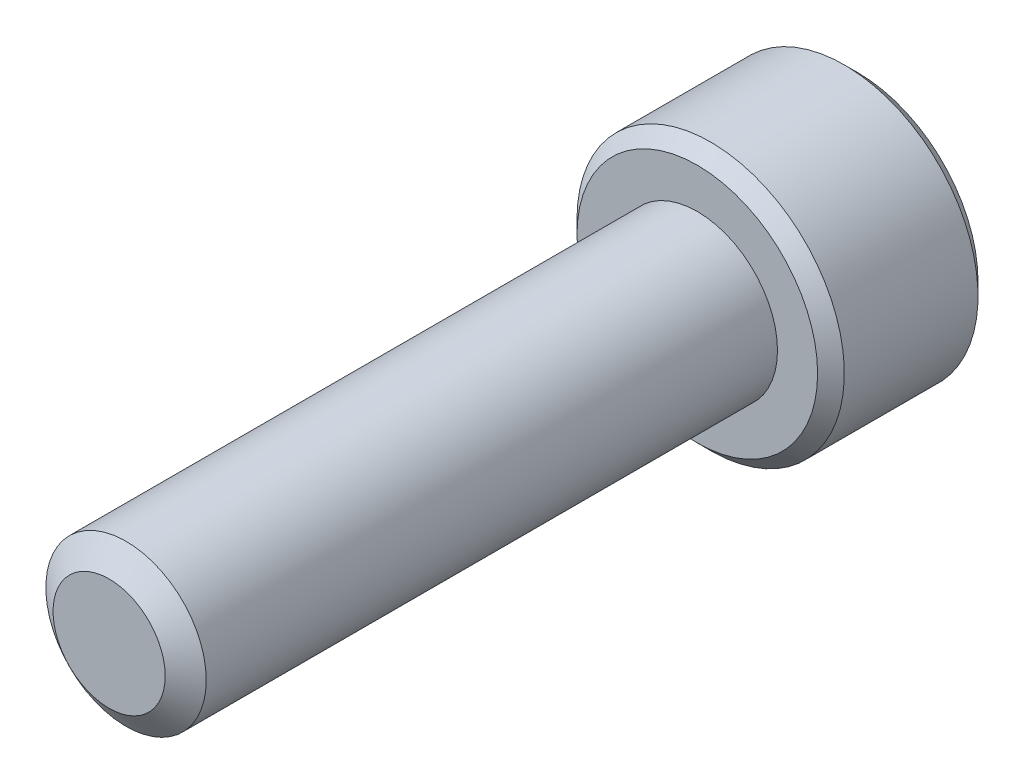
ISO-10303-21;
HEADER;
FILE_DESCRIPTION(('STEP AP214'),'2;1');
FILE_NAME('part.step','',(''),(''),'','','');
FILE_SCHEMA(('AUTOMOTIVE_DESIGN { 1 0 10303 214 1 1 1 1 }'));
ENDSEC;
DATA;
#1=APPLICATION_CONTEXT('core data for automotive mechanical design processes');
#2=APPLICATION_PROTOCOL_DEFINITION('international standard','automotive_design',2000,#1);
#3=PRODUCT_CONTEXT('',#1,'mechanical');
#4=PRODUCT('Part','Part','',(#3));
#5=PRODUCT_RELATED_PRODUCT_CATEGORY('part','',(#4));
#6=PRODUCT_DEFINITION_FORMATION('','',#4);
#7=PRODUCT_DEFINITION_CONTEXT('part definition',#1,'design');
#8=PRODUCT_DEFINITION('design','',#6,#7);
#9=PRODUCT_DEFINITION_SHAPE('','',#8);
#10=(LENGTH_UNIT() NAMED_UNIT(*) SI_UNIT(.MILLI.,.METRE.));
#11=(NAMED_UNIT(*) PLANE_ANGLE_UNIT() SI_UNIT($,.RADIAN.));
#12=(NAMED_UNIT(*) SI_UNIT($,.STERADIAN.) SOLID_ANGLE_UNIT());
#13=UNCERTAINTY_MEASURE_WITH_UNIT(LENGTH_MEASURE(1.E-05),#10,'distance_accuracy_value','');
#14=(GEOMETRIC_REPRESENTATION_CONTEXT(3) GLOBAL_UNCERTAINTY_ASSIGNED_CONTEXT((#13)) GLOBAL_UNIT_ASSIGNED_CONTEXT((#10,
#11,#12)) REPRESENTATION_CONTEXT('',''));
#15=CARTESIAN_POINT('',(0.,0.,0.));
#16=DIRECTION('',(0.,0.,1.));
#17=DIRECTION('',(1.,0.,0.));
#18=AXIS2_PLACEMENT_3D('',#15,#16,#17);
#19=CARTESIAN_POINT('',(0.,0.,-22.));
#20=DIRECTION('',(0.,0.,1.));
#21=DIRECTION('',(1.,0.,0.));
#22=AXIS2_PLACEMENT_3D('',#19,#20,#21);
#23=CYLINDRICAL_SURFACE('',#22,3.);
#24=CARTESIAN_POINT('',(0.,0.,-22.));
#25=DIRECTION('',(0.,0.,-1.));
#26=DIRECTION('',(-1.,0.,0.));
#27=AXIS2_PLACEMENT_3D('',#24,#25,#26);
#28=CIRCLE('',#27,3.);
#29=CARTESIAN_POINT('',(-3.,0.,-22.));
#30=VERTEX_POINT('',#29);
#31=EDGE_CURVE('E154',#30,#30,#28,.F.);
#32=ORIENTED_EDGE('',*,*,#31,.T.);
#33=EDGE_LOOP('',(#32));
#34=FACE_BOUND('',#33,.T.);
#35=CARTESIAN_POINT('',(0.,0.,-0.632650851713494));
#36=DIRECTION('',(0.,0.,1.));
#37=DIRECTION('',(1.,0.,0.));
#38=AXIS2_PLACEMENT_3D('',#35,#36,#37);
#39=CIRCLE('',#38,3.);
#40=CARTESIAN_POINT('',(3.,0.,-0.632650851713494));
#41=VERTEX_POINT('',#40);
#42=EDGE_CURVE('E171',#41,#41,#39,.T.);
#43=ORIENTED_EDGE('',*,*,#42,.F.);
#44=EDGE_LOOP('',(#43));
#45=FACE_BOUND('',#44,.T.);
#46=ADVANCED_FACE('F39',(#34,#45),#23,.T.);
#47=CARTESIAN_POINT('',(0.,0.,0.));
#48=DIRECTION('',(0.,0.,-1.));
#49=DIRECTION('',(-1.,0.,0.));
#50=AXIS2_PLACEMENT_3D('',#47,#48,#49);
#51=CONICAL_SURFACE('',#50,2.09648094716167,0.959931088596884);
#52=ORIENTED_EDGE('',*,*,#42,.T.);
#53=EDGE_LOOP('',(#52));
#54=FACE_BOUND('',#53,.T.);
#55=CARTESIAN_POINT('',(0.,0.,0.));
#56=DIRECTION('',(0.,0.,1.));
#57=DIRECTION('',(1.,0.,0.));
#58=AXIS2_PLACEMENT_3D('',#55,#56,#57);
#59=CIRCLE('',#58,2.09648094716167);
#60=CARTESIAN_POINT('',(2.09648094716167,0.,0.));
#61=VERTEX_POINT('',#60);
#62=EDGE_CURVE('E167',#61,#61,#59,.T.);
#63=ORIENTED_EDGE('',*,*,#62,.F.);
#64=EDGE_LOOP('',(#63));
#65=FACE_BOUND('',#64,.T.);
#66=ADVANCED_FACE('F220',(#54,#65),#51,.T.);
#67=CARTESIAN_POINT('',(0.,0.,0.));
#68=DIRECTION('',(0.,0.,1.));
#69=DIRECTION('',(1.,0.,0.));
#70=AXIS2_PLACEMENT_3D('',#67,#68,#69);
#71=PLANE('',#70);
#72=ORIENTED_EDGE('',*,*,#62,.T.);
#73=EDGE_LOOP('',(#72));
#74=FACE_BOUND('',#73,.T.);
#75=ADVANCED_FACE('F226',(#74),#71,.T.);
#76=CARTESIAN_POINT('',(0.,0.,-28.));
#77=DIRECTION('',(0.,0.,1.));
#78=DIRECTION('',(1.,0.,0.));
#79=AXIS2_PLACEMENT_3D('',#76,#77,#78);
#80=CYLINDRICAL_SURFACE('',#79,5.);
#81=CARTESIAN_POINT('',(0.,0.,-27.5));
#82=DIRECTION('',(0.,0.,-1.));
#83=DIRECTION('',(-1.,0.,0.));
#84=AXIS2_PLACEMENT_3D('',#81,#82,#83);
#85=CIRCLE('',#84,5.);
#86=CARTESIAN_POINT('',(-5.,0.,-27.5));
#87=VERTEX_POINT('',#86);
#88=EDGE_CURVE('E48',#87,#87,#85,.F.);
#89=ORIENTED_EDGE('',*,*,#88,.T.);
#90=EDGE_LOOP('',(#89));
#91=FACE_BOUND('',#90,.T.);
#92=CARTESIAN_POINT('',(0.,0.,-22.5));
#93=DIRECTION('',(0.,0.,-1.));
#94=DIRECTION('',(-1.,0.,0.));
#95=AXIS2_PLACEMENT_3D('',#92,#93,#94);
#96=CIRCLE('',#95,5.);
#97=CARTESIAN_POINT('',(-5.,0.,-22.5));
#98=VERTEX_POINT('',#97);
#99=EDGE_CURVE('E179',#98,#98,#96,.T.);
#100=ORIENTED_EDGE('',*,*,#99,.T.);
#101=EDGE_LOOP('',(#100));
#102=FACE_BOUND('',#101,.T.);
#103=ADVANCED_FACE('F186',(#91,#102),#80,.T.);
#104=CARTESIAN_POINT('',(0.,0.,-28.));
#105=DIRECTION('',(0.,0.,-1.));
#106=DIRECTION('',(-1.,0.,0.));
#107=AXIS2_PLACEMENT_3D('',#104,#105,#106);
#108=PLANE('',#107);
#109=CARTESIAN_POINT('',(0.,0.,-28.));
#110=DIRECTION('',(0.,0.,-1.));
#111=DIRECTION('',(-1.,0.,0.));
#112=AXIS2_PLACEMENT_3D('',#109,#110,#111);
#113=CIRCLE('',#112,4.5);
#114=CARTESIAN_POINT('',(-4.5,0.,-28.));
#115=VERTEX_POINT('',#114);
#116=EDGE_CURVE('E175',#115,#115,#113,.T.);
#117=ORIENTED_EDGE('',*,*,#116,.T.);
#118=EDGE_LOOP('',(#117));
#119=FACE_BOUND('',#118,.T.);
#120=DIRECTION('',(0.866025403784439,0.5,0.));
#121=VECTOR('',#120,1.);
#122=CARTESIAN_POINT('',(-2.5,1.44337567297406,-28.));
#123=LINE('',#122,#121);
#124=CARTESIAN_POINT('',(-2.5,1.44337567297406,-28.));
#125=VERTEX_POINT('',#124);
#126=CARTESIAN_POINT('',(0.,2.88675134594813,-28.));
#127=VERTEX_POINT('',#126);
#128=EDGE_CURVE('E55',#125,#127,#123,.T.);
#129=ORIENTED_EDGE('',*,*,#128,.F.);
#130=DIRECTION('',(0.,1.,0.));
#131=VECTOR('',#130,1.);
#132=CARTESIAN_POINT('',(-2.5,-1.44337567297406,-28.));
#133=LINE('',#132,#131);
#134=CARTESIAN_POINT('',(-2.5,-1.44337567297406,-28.));
#135=VERTEX_POINT('',#134);
#136=EDGE_CURVE('E148',#135,#125,#133,.T.);
#137=ORIENTED_EDGE('',*,*,#136,.F.);
#138=DIRECTION('',(-0.866025403784439,0.5,0.));
#139=VECTOR('',#138,1.);
#140=CARTESIAN_POINT('',(0.,-2.88675134594813,-28.));
#141=LINE('',#140,#139);
#142=CARTESIAN_POINT('',(0.,-2.88675134594813,-28.));
#143=VERTEX_POINT('',#142);
#144=EDGE_CURVE('E145',#143,#135,#141,.T.);
#145=ORIENTED_EDGE('',*,*,#144,.F.);
#146=DIRECTION('',(-0.866025403784439,-0.5,0.));
#147=VECTOR('',#146,1.);
#148=CARTESIAN_POINT('',(2.5,-1.44337567297407,-28.));
#149=LINE('',#148,#147);
#150=CARTESIAN_POINT('',(2.5,-1.44337567297407,-28.));
#151=VERTEX_POINT('',#150);
#152=EDGE_CURVE('E103',#151,#143,#149,.T.);
#153=ORIENTED_EDGE('',*,*,#152,.F.);
#154=DIRECTION('',(0.,-1.,0.));
#155=VECTOR('',#154,1.);
#156=CARTESIAN_POINT('',(2.5,1.44337567297406,-28.));
#157=LINE('',#156,#155);
#158=CARTESIAN_POINT('',(2.5,1.44337567297406,-28.));
#159=VERTEX_POINT('',#158);
#160=EDGE_CURVE('E139',#159,#151,#157,.T.);
#161=ORIENTED_EDGE('',*,*,#160,.F.);
#162=DIRECTION('',(0.866025403784439,-0.5,0.));
#163=VECTOR('',#162,1.);
#164=CARTESIAN_POINT('',(0.,2.88675134594813,-28.));
#165=LINE('',#164,#163);
#166=EDGE_CURVE('E135',#127,#159,#165,.T.);
#167=ORIENTED_EDGE('',*,*,#166,.F.);
#168=EDGE_LOOP('',(#129,#137,#145,#153,#161,#167));
#169=FACE_BOUND('',#168,.T.);
#170=ADVANCED_FACE('F194',(#119,#169),#108,.T.);
#171=CARTESIAN_POINT('',(0.,0.,-22.));
#172=DIRECTION('',(0.,0.,-1.));
#173=DIRECTION('',(-1.,0.,0.));
#174=AXIS2_PLACEMENT_3D('',#171,#172,#173);
#175=PLANE('',#174);
#176=CARTESIAN_POINT('',(0.,0.,-22.));
#177=DIRECTION('',(0.,0.,-1.));
#178=DIRECTION('',(-1.,0.,0.));
#179=AXIS2_PLACEMENT_3D('',#176,#177,#178);
#180=CIRCLE('',#179,4.5);
#181=CARTESIAN_POINT('',(-4.5,0.,-22.));
#182=VERTEX_POINT('',#181);
#183=EDGE_CURVE('E11',#182,#182,#180,.F.);
#184=ORIENTED_EDGE('',*,*,#183,.T.);
#185=EDGE_LOOP('',(#184));
#186=FACE_BOUND('',#185,.T.);
#187=ORIENTED_EDGE('',*,*,#31,.F.);
#188=EDGE_LOOP('',(#187));
#189=FACE_BOUND('',#188,.T.);
#190=ADVANCED_FACE('F197',(#186,#189),#175,.F.);
#191=CARTESIAN_POINT('',(-2.5,1.44337567297406,-24.25));
#192=DIRECTION('',(-0.5,0.866025403784439,0.));
#193=DIRECTION('',(-0.866025403784439,-0.5,0.));
#194=AXIS2_PLACEMENT_3D('',#191,#192,#193);
#195=PLANE('',#194);
#196=ORIENTED_EDGE('',*,*,#128,.T.);
#197=DIRECTION('',(0.,0.,-1.));
#198=VECTOR('',#197,1.);
#199=CARTESIAN_POINT('',(0.,2.88675134594813,-24.25));
#200=LINE('',#199,#198);
#201=CARTESIAN_POINT('',(0.,2.88675134594813,-24.25));
#202=VERTEX_POINT('',#201);
#203=EDGE_CURVE('E85',#202,#127,#200,.T.);
#204=ORIENTED_EDGE('',*,*,#203,.F.);
#205=DIRECTION('',(0.866025403784439,0.5,0.));
#206=VECTOR('',#205,1.);
#207=CARTESIAN_POINT('',(-2.5,1.44337567297406,-24.25));
#208=LINE('',#207,#206);
#209=CARTESIAN_POINT('',(-2.5,1.44337567297406,-24.25));
#210=VERTEX_POINT('',#209);
#211=EDGE_CURVE('E151',#210,#202,#208,.T.);
#212=ORIENTED_EDGE('',*,*,#211,.F.);
#213=DIRECTION('',(0.,0.,-1.));
#214=VECTOR('',#213,1.);
#215=CARTESIAN_POINT('',(-2.5,1.44337567297406,-24.25));
#216=LINE('',#215,#214);
#217=EDGE_CURVE('E63',#210,#125,#216,.T.);
#218=ORIENTED_EDGE('',*,*,#217,.T.);
#219=EDGE_LOOP('',(#196,#204,#212,#218));
#220=FACE_BOUND('',#219,.T.);
#221=ADVANCED_FACE('F207',(#220),#195,.F.);
#222=CARTESIAN_POINT('',(-2.5,-1.44337567297406,-24.25));
#223=DIRECTION('',(-1.,0.,0.));
#224=DIRECTION('',(0.,-1.,0.));
#225=AXIS2_PLACEMENT_3D('',#222,#223,#224);
#226=PLANE('',#225);
#227=ORIENTED_EDGE('',*,*,#136,.T.);
#228=ORIENTED_EDGE('',*,*,#217,.F.);
#229=DIRECTION('',(0.,1.,0.));
#230=VECTOR('',#229,1.);
#231=CARTESIAN_POINT('',(-2.5,-1.44337567297406,-24.25));
#232=LINE('',#231,#230);
#233=CARTESIAN_POINT('',(-2.5,-1.44337567297406,-24.25));
#234=VERTEX_POINT('',#233);
#235=EDGE_CURVE('E117',#234,#210,#232,.T.);
#236=ORIENTED_EDGE('',*,*,#235,.F.);
#237=DIRECTION('',(0.,0.,-1.));
#238=VECTOR('',#237,1.);
#239=CARTESIAN_POINT('',(-2.5,-1.44337567297406,-24.25));
#240=LINE('',#239,#238);
#241=EDGE_CURVE('E108',#234,#135,#240,.T.);
#242=ORIENTED_EDGE('',*,*,#241,.T.);
#243=EDGE_LOOP('',(#227,#228,#236,#242));
#244=FACE_BOUND('',#243,.T.);
#245=ADVANCED_FACE('F209',(#244),#226,.F.);
#246=CARTESIAN_POINT('',(0.,-2.88675134594813,-24.25));
#247=DIRECTION('',(-0.5,-0.866025403784439,0.));
#248=DIRECTION('',(0.866025403784439,-0.5,0.));
#249=AXIS2_PLACEMENT_3D('',#246,#247,#248);
#250=PLANE('',#249);
#251=ORIENTED_EDGE('',*,*,#144,.T.);
#252=ORIENTED_EDGE('',*,*,#241,.F.);
#253=DIRECTION('',(-0.866025403784439,0.5,0.));
#254=VECTOR('',#253,1.);
#255=CARTESIAN_POINT('',(0.,-2.88675134594813,-24.25));
#256=LINE('',#255,#254);
#257=CARTESIAN_POINT('',(0.,-2.88675134594813,-24.25));
#258=VERTEX_POINT('',#257);
#259=EDGE_CURVE('E112',#258,#234,#256,.T.);
#260=ORIENTED_EDGE('',*,*,#259,.F.);
#261=DIRECTION('',(0.,0.,-1.));
#262=VECTOR('',#261,1.);
#263=CARTESIAN_POINT('',(0.,-2.88675134594813,-24.25));
#264=LINE('',#263,#262);
#265=EDGE_CURVE('E96',#258,#143,#264,.T.);
#266=ORIENTED_EDGE('',*,*,#265,.T.);
#267=EDGE_LOOP('',(#251,#252,#260,#266));
#268=FACE_BOUND('',#267,.T.);
#269=ADVANCED_FACE('F113',(#268),#250,.F.);
#270=CARTESIAN_POINT('',(2.5,-1.44337567297407,-24.25));
#271=DIRECTION('',(0.5,-0.866025403784439,0.));
#272=DIRECTION('',(0.866025403784439,0.5,0.));
#273=AXIS2_PLACEMENT_3D('',#270,#271,#272);
#274=PLANE('',#273);
#275=ORIENTED_EDGE('',*,*,#152,.T.);
#276=ORIENTED_EDGE('',*,*,#265,.F.);
#277=DIRECTION('',(-0.866025403784439,-0.5,0.));
#278=VECTOR('',#277,1.);
#279=CARTESIAN_POINT('',(2.5,-1.44337567297407,-24.25));
#280=LINE('',#279,#278);
#281=CARTESIAN_POINT('',(2.5,-1.44337567297407,-24.25));
#282=VERTEX_POINT('',#281);
#283=EDGE_CURVE('E100',#282,#258,#280,.T.);
#284=ORIENTED_EDGE('',*,*,#283,.F.);
#285=DIRECTION('',(0.,0.,-1.));
#286=VECTOR('',#285,1.);
#287=CARTESIAN_POINT('',(2.5,-1.44337567297407,-24.25));
#288=LINE('',#287,#286);
#289=EDGE_CURVE('E109',#282,#151,#288,.T.);
#290=ORIENTED_EDGE('',*,*,#289,.T.);
#291=EDGE_LOOP('',(#275,#276,#284,#290));
#292=FACE_BOUND('',#291,.T.);
#293=ADVANCED_FACE('F98',(#292),#274,.F.);
#294=CARTESIAN_POINT('',(2.5,1.44337567297406,-24.25));
#295=DIRECTION('',(1.,0.,0.));
#296=DIRECTION('',(0.,0.,-1.));
#297=AXIS2_PLACEMENT_3D('',#294,#295,#296);
#298=PLANE('',#297);
#299=ORIENTED_EDGE('',*,*,#160,.T.);
#300=ORIENTED_EDGE('',*,*,#289,.F.);
#301=DIRECTION('',(0.,-1.,0.));
#302=VECTOR('',#301,1.);
#303=CARTESIAN_POINT('',(2.5,1.44337567297406,-24.25));
#304=LINE('',#303,#302);
#305=CARTESIAN_POINT('',(2.5,1.44337567297406,-24.25));
#306=VERTEX_POINT('',#305);
#307=EDGE_CURVE('E123',#306,#282,#304,.T.);
#308=ORIENTED_EDGE('',*,*,#307,.F.);
#309=DIRECTION('',(0.,0.,-1.));
#310=VECTOR('',#309,1.);
#311=CARTESIAN_POINT('',(2.5,1.44337567297406,-24.25));
#312=LINE('',#311,#310);
#313=EDGE_CURVE('E159',#306,#159,#312,.T.);
#314=ORIENTED_EDGE('',*,*,#313,.T.);
#315=EDGE_LOOP('',(#299,#300,#308,#314));
#316=FACE_BOUND('',#315,.T.);
#317=ADVANCED_FACE('F281',(#316),#298,.F.);
#318=CARTESIAN_POINT('',(0.,2.88675134594813,-24.25));
#319=DIRECTION('',(0.5,0.866025403784439,0.));
#320=DIRECTION('',(-0.866025403784439,0.5,0.));
#321=AXIS2_PLACEMENT_3D('',#318,#319,#320);
#322=PLANE('',#321);
#323=ORIENTED_EDGE('',*,*,#166,.T.);
#324=ORIENTED_EDGE('',*,*,#313,.F.);
#325=DIRECTION('',(0.866025403784439,-0.5,0.));
#326=VECTOR('',#325,1.);
#327=CARTESIAN_POINT('',(0.,2.88675134594813,-24.25));
#328=LINE('',#327,#326);
#329=EDGE_CURVE('E127',#202,#306,#328,.T.);
#330=ORIENTED_EDGE('',*,*,#329,.F.);
#331=ORIENTED_EDGE('',*,*,#203,.T.);
#332=EDGE_LOOP('',(#323,#324,#330,#331));
#333=FACE_BOUND('',#332,.T.);
#334=ADVANCED_FACE('F203',(#333),#322,.F.);
#335=CARTESIAN_POINT('',(2.5,4.33012701892219,-24.25));
#336=DIRECTION('',(0.,0.,-1.));
#337=DIRECTION('',(-1.,0.,0.));
#338=AXIS2_PLACEMENT_3D('',#335,#336,#337);
#339=PLANE('',#338);
#340=ORIENTED_EDGE('',*,*,#211,.T.);
#341=ORIENTED_EDGE('',*,*,#329,.T.);
#342=ORIENTED_EDGE('',*,*,#307,.T.);
#343=ORIENTED_EDGE('',*,*,#283,.T.);
#344=ORIENTED_EDGE('',*,*,#259,.T.);
#345=ORIENTED_EDGE('',*,*,#235,.T.);
#346=EDGE_LOOP('',(#340,#341,#342,#343,#344,#345));
#347=FACE_BOUND('',#346,.T.);
#348=ADVANCED_FACE('F120',(#347),#339,.T.);
#349=CARTESIAN_POINT('',(0.,0.,-28.));
#350=DIRECTION('',(0.,0.,1.));
#351=DIRECTION('',(1.,0.,0.));
#352=AXIS2_PLACEMENT_3D('',#349,#350,#351);
#353=CONICAL_SURFACE('',#352,4.5,0.785398163397451);
#354=ORIENTED_EDGE('',*,*,#88,.F.);
#355=EDGE_LOOP('',(#354));
#356=FACE_BOUND('',#355,.T.);
#357=ORIENTED_EDGE('',*,*,#116,.F.);
#358=EDGE_LOOP('',(#357));
#359=FACE_BOUND('',#358,.T.);
#360=ADVANCED_FACE('F189',(#356,#359),#353,.T.);
#361=CARTESIAN_POINT('',(0.,0.,-22.5));
#362=DIRECTION('',(0.,0.,-1.));
#363=DIRECTION('',(-1.,0.,0.));
#364=AXIS2_PLACEMENT_3D('',#361,#362,#363);
#365=CONICAL_SURFACE('',#364,5.,0.785398163397454);
#366=ORIENTED_EDGE('',*,*,#183,.F.);
#367=EDGE_LOOP('',(#366));
#368=FACE_BOUND('',#367,.T.);
#369=ORIENTED_EDGE('',*,*,#99,.F.);
#370=EDGE_LOOP('',(#369));
#371=FACE_BOUND('',#370,.T.);
#372=ADVANCED_FACE('F41',(#368,#371),#365,.T.);
#373=CLOSED_SHELL('',(#46,#66,#75,#103,#170,#190,#221,#245,#269,#293,#317,#334,#348,#360,#372));
#374=MANIFOLD_SOLID_BREP('B2',#373);
#375=ADVANCED_BREP_SHAPE_REPRESENTATION('',(#18,#374),#14);
#376=SHAPE_DEFINITION_REPRESENTATION(#9,#375);
ENDSEC;
END-ISO-10303-21;
